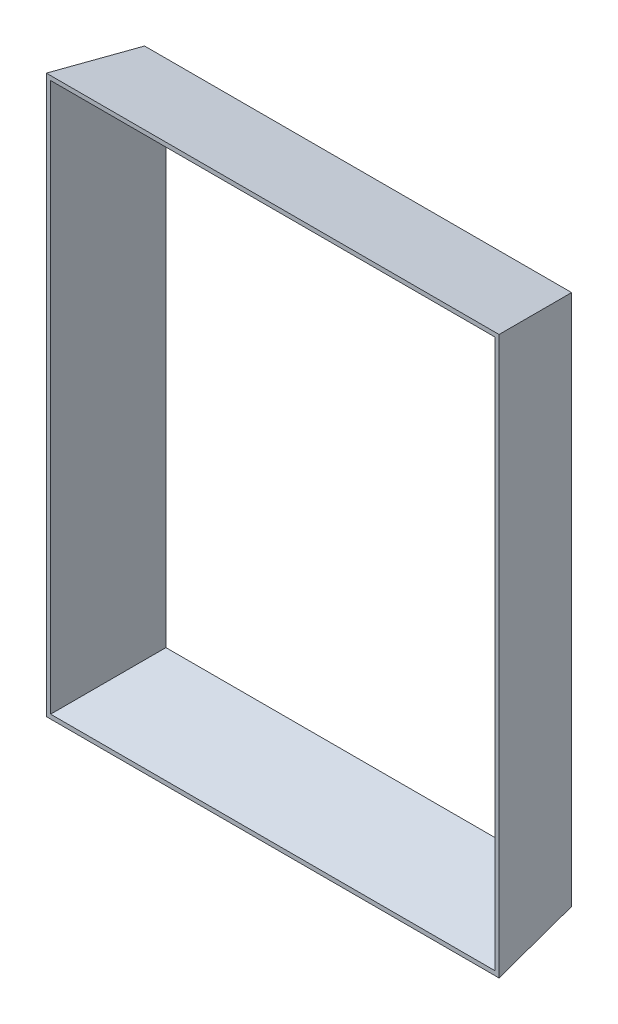
ISO-10303-21;
HEADER;
FILE_DESCRIPTION(('STEP AP214'),'2;1');
FILE_NAME('part.step','',(''),(''),'','','');
FILE_SCHEMA(('AUTOMOTIVE_DESIGN { 1 0 10303 214 1 1 1 1 }'));
ENDSEC;
DATA;
#1=APPLICATION_CONTEXT('core data for automotive mechanical design processes');
#2=APPLICATION_PROTOCOL_DEFINITION('international standard','automotive_design',2000,#1);
#3=PRODUCT_CONTEXT('',#1,'mechanical');
#4=PRODUCT('Part','Part','',(#3));
#5=PRODUCT_RELATED_PRODUCT_CATEGORY('part','',(#4));
#6=PRODUCT_DEFINITION_FORMATION('','',#4);
#7=PRODUCT_DEFINITION_CONTEXT('part definition',#1,'design');
#8=PRODUCT_DEFINITION('design','',#6,#7);
#9=PRODUCT_DEFINITION_SHAPE('','',#8);
#10=(LENGTH_UNIT() NAMED_UNIT(*) SI_UNIT(.MILLI.,.METRE.));
#11=(NAMED_UNIT(*) PLANE_ANGLE_UNIT() SI_UNIT($,.RADIAN.));
#12=(NAMED_UNIT(*) SI_UNIT($,.STERADIAN.) SOLID_ANGLE_UNIT());
#13=UNCERTAINTY_MEASURE_WITH_UNIT(LENGTH_MEASURE(1.E-05),#10,'distance_accuracy_value','');
#14=(GEOMETRIC_REPRESENTATION_CONTEXT(3) GLOBAL_UNCERTAINTY_ASSIGNED_CONTEXT((#13)) GLOBAL_UNIT_ASSIGNED_CONTEXT((#10,
#11,#12)) REPRESENTATION_CONTEXT('',''));
#15=CARTESIAN_POINT('',(0.,0.,0.));
#16=DIRECTION('',(0.,0.,1.));
#17=DIRECTION('',(1.,0.,0.));
#18=AXIS2_PLACEMENT_3D('',#15,#16,#17);
#19=CARTESIAN_POINT('',(0.,0.,0.));
#20=DIRECTION('',(0.,0.,1.));
#21=DIRECTION('',(1.,0.,0.));
#22=AXIS2_PLACEMENT_3D('',#19,#20,#21);
#23=PLANE('',#22);
#24=DIRECTION('',(0.,-1.,0.));
#25=VECTOR('',#24,1.);
#26=CARTESIAN_POINT('',(-1254.02572347267,611.927652733119,0.));
#27=LINE('',#26,#25);
#28=CARTESIAN_POINT('',(-1254.02572347267,611.927652733119,0.));
#29=VERTEX_POINT('',#28);
#30=CARTESIAN_POINT('',(-1254.02572347267,-633.072347266881,0.));
#31=VERTEX_POINT('',#30);
#32=EDGE_CURVE('E177',#29,#31,#27,.T.);
#33=ORIENTED_EDGE('',*,*,#32,.F.);
#34=DIRECTION('',(-1.,0.,0.));
#35=VECTOR('',#34,1.);
#36=CARTESIAN_POINT('',(-1254.02572347267,611.927652733119,0.));
#37=LINE('',#36,#35);
#38=CARTESIAN_POINT('',(-254.025723472669,611.927652733119,0.));
#39=VERTEX_POINT('',#38);
#40=EDGE_CURVE('E12',#39,#29,#37,.T.);
#41=ORIENTED_EDGE('',*,*,#40,.F.);
#42=DIRECTION('',(0.,1.,0.));
#43=VECTOR('',#42,1.);
#44=CARTESIAN_POINT('',(-254.025723472669,611.927652733119,0.));
#45=LINE('',#44,#43);
#46=CARTESIAN_POINT('',(-254.025723472668,-633.072347266881,0.));
#47=VERTEX_POINT('',#46);
#48=EDGE_CURVE('E62',#47,#39,#45,.T.);
#49=ORIENTED_EDGE('',*,*,#48,.F.);
#50=DIRECTION('',(1.,0.,0.));
#51=VECTOR('',#50,1.);
#52=CARTESIAN_POINT('',(-1254.02572347267,-633.072347266881,0.));
#53=LINE('',#52,#51);
#54=EDGE_CURVE('E178',#31,#47,#53,.T.);
#55=ORIENTED_EDGE('',*,*,#54,.F.);
#56=EDGE_LOOP('',(#33,#41,#49,#55));
#57=FACE_BOUND('',#56,.T.);
#58=DIRECTION('',(0.,-1.,0.));
#59=VECTOR('',#58,1.);
#60=CARTESIAN_POINT('',(-1204.02572347267,561.927652733119,0.));
#61=LINE('',#60,#59);
#62=CARTESIAN_POINT('',(-1204.02572347267,561.927652733119,0.));
#63=VERTEX_POINT('',#62);
#64=CARTESIAN_POINT('',(-1204.02572347267,-583.072347266881,0.));
#65=VERTEX_POINT('',#64);
#66=EDGE_CURVE('E129',#63,#65,#61,.T.);
#67=ORIENTED_EDGE('',*,*,#66,.T.);
#68=DIRECTION('',(1.,0.,0.));
#69=VECTOR('',#68,1.);
#70=CARTESIAN_POINT('',(-1204.02572347267,-583.072347266881,0.));
#71=LINE('',#70,#69);
#72=CARTESIAN_POINT('',(-304.025723472668,-583.072347266881,0.));
#73=VERTEX_POINT('',#72);
#74=EDGE_CURVE('E119',#65,#73,#71,.T.);
#75=ORIENTED_EDGE('',*,*,#74,.T.);
#76=DIRECTION('',(0.,1.,0.));
#77=VECTOR('',#76,1.);
#78=CARTESIAN_POINT('',(-304.025723472668,-583.072347266881,0.));
#79=LINE('',#78,#77);
#80=CARTESIAN_POINT('',(-304.025723472669,561.927652733119,0.));
#81=VERTEX_POINT('',#80);
#82=EDGE_CURVE('E128',#73,#81,#79,.T.);
#83=ORIENTED_EDGE('',*,*,#82,.T.);
#84=DIRECTION('',(-1.,0.,0.));
#85=VECTOR('',#84,1.);
#86=CARTESIAN_POINT('',(-304.025723472669,561.927652733119,0.));
#87=LINE('',#86,#85);
#88=EDGE_CURVE('E138',#81,#63,#87,.T.);
#89=ORIENTED_EDGE('',*,*,#88,.T.);
#90=EDGE_LOOP('',(#67,#75,#83,#89));
#91=FACE_BOUND('',#90,.T.);
#92=ADVANCED_FACE('F53',(#57,#91),#23,.F.);
#93=CARTESIAN_POINT('',(0.,0.,200.));
#94=DIRECTION('',(0.,0.,1.));
#95=DIRECTION('',(1.,0.,0.));
#96=AXIS2_PLACEMENT_3D('',#93,#94,#95);
#97=PLANE('',#96);
#98=DIRECTION('',(1.,0.,0.));
#99=VECTOR('',#98,1.);
#100=CARTESIAN_POINT('',(-1284.02572347267,-663.072347266881,200.));
#101=LINE('',#100,#99);
#102=CARTESIAN_POINT('',(-1284.02572347267,-663.072347266881,200.));
#103=VERTEX_POINT('',#102);
#104=CARTESIAN_POINT('',(-224.025723472668,-663.072347266881,200.));
#105=VERTEX_POINT('',#104);
#106=EDGE_CURVE('E164',#103,#105,#101,.T.);
#107=ORIENTED_EDGE('',*,*,#106,.T.);
#108=DIRECTION('',(0.,1.,0.));
#109=VECTOR('',#108,1.);
#110=CARTESIAN_POINT('',(-224.025723472668,-663.072347266881,200.));
#111=LINE('',#110,#109);
#112=CARTESIAN_POINT('',(-224.025723472669,641.927652733119,200.));
#113=VERTEX_POINT('',#112);
#114=EDGE_CURVE('E240',#105,#113,#111,.T.);
#115=ORIENTED_EDGE('',*,*,#114,.T.);
#116=DIRECTION('',(-1.,0.,0.));
#117=VECTOR('',#116,1.);
#118=CARTESIAN_POINT('',(-224.025723472669,641.927652733119,200.));
#119=LINE('',#118,#117);
#120=CARTESIAN_POINT('',(-1284.02572347267,641.927652733119,200.));
#121=VERTEX_POINT('',#120);
#122=EDGE_CURVE('E224',#113,#121,#119,.T.);
#123=ORIENTED_EDGE('',*,*,#122,.T.);
#124=DIRECTION('',(0.,-1.,0.));
#125=VECTOR('',#124,1.);
#126=CARTESIAN_POINT('',(-1284.02572347267,641.927652733119,200.));
#127=LINE('',#126,#125);
#128=EDGE_CURVE('E304',#121,#103,#127,.T.);
#129=ORIENTED_EDGE('',*,*,#128,.T.);
#130=EDGE_LOOP('',(#107,#115,#123,#129));
#131=FACE_BOUND('',#130,.T.);
#132=DIRECTION('',(1.,0.,0.));
#133=VECTOR('',#132,1.);
#134=CARTESIAN_POINT('',(-1274.02572347267,-653.072347266881,200.));
#135=LINE('',#134,#133);
#136=CARTESIAN_POINT('',(-1274.02572347267,-653.072347266881,200.));
#137=VERTEX_POINT('',#136);
#138=CARTESIAN_POINT('',(-234.025723472668,-653.072347266881,200.));
#139=VERTEX_POINT('',#138);
#140=EDGE_CURVE('E78',#137,#139,#135,.T.);
#141=ORIENTED_EDGE('',*,*,#140,.F.);
#142=DIRECTION('',(0.,-1.,0.));
#143=VECTOR('',#142,1.);
#144=CARTESIAN_POINT('',(-1274.02572347267,631.927652733119,200.));
#145=LINE('',#144,#143);
#146=CARTESIAN_POINT('',(-1274.02572347267,631.927652733119,200.));
#147=VERTEX_POINT('',#146);
#148=EDGE_CURVE('E136',#147,#137,#145,.T.);
#149=ORIENTED_EDGE('',*,*,#148,.F.);
#150=DIRECTION('',(-1.,0.,0.));
#151=VECTOR('',#150,1.);
#152=CARTESIAN_POINT('',(-234.025723472669,631.927652733119,200.));
#153=LINE('',#152,#151);
#154=CARTESIAN_POINT('',(-234.025723472669,631.927652733119,200.));
#155=VERTEX_POINT('',#154);
#156=EDGE_CURVE('E152',#155,#147,#153,.T.);
#157=ORIENTED_EDGE('',*,*,#156,.F.);
#158=DIRECTION('',(0.,1.,0.));
#159=VECTOR('',#158,1.);
#160=CARTESIAN_POINT('',(-234.025723472668,-653.072347266881,200.));
#161=LINE('',#160,#159);
#162=EDGE_CURVE('E160',#139,#155,#161,.T.);
#163=ORIENTED_EDGE('',*,*,#162,.F.);
#164=EDGE_LOOP('',(#141,#149,#157,#163));
#165=FACE_BOUND('',#164,.T.);
#166=ADVANCED_FACE('F336',(#131,#165),#97,.T.);
#167=CARTESIAN_POINT('',(-1226.43102540114,-2.18732845383934E-13,-183.964653810172));
#168=DIRECTION('',(-0.988936352868298,0.,-0.148340452930245));
#169=DIRECTION('',(-0.148340452930245,0.,0.988936352868298));
#170=AXIS2_PLACEMENT_3D('',#167,#168,#169);
#171=PLANE('',#170);
#172=DIRECTION('',(0.146734796413356,-0.146734796413356,-0.978231976089037));
#173=VECTOR('',#172,1.);
#174=CARTESIAN_POINT('',(-1284.02572347267,641.927652733119,200.));
#175=LINE('',#174,#173);
#176=EDGE_CURVE('E230',#121,#29,#175,.T.);
#177=ORIENTED_EDGE('',*,*,#176,.T.);
#178=ORIENTED_EDGE('',*,*,#32,.T.);
#179=DIRECTION('',(0.146734796413356,0.146734796413356,-0.978231976089037));
#180=VECTOR('',#179,1.);
#181=CARTESIAN_POINT('',(-1284.02572347267,-663.072347266881,200.));
#182=LINE('',#181,#180);
#183=EDGE_CURVE('E226',#103,#31,#182,.T.);
#184=ORIENTED_EDGE('',*,*,#183,.F.);
#185=ORIENTED_EDGE('',*,*,#128,.F.);
#186=EDGE_LOOP('',(#177,#178,#184,#185));
#187=FACE_BOUND('',#186,.T.);
#188=ADVANCED_FACE('F277',(#187),#171,.T.);
#189=CARTESIAN_POINT('',(0.,-619.14165991871,-92.8712489878066));
#190=DIRECTION('',(0.,-0.988936352868298,-0.148340452930245));
#191=DIRECTION('',(0.,0.148340452930245,-0.988936352868298));
#192=AXIS2_PLACEMENT_3D('',#189,#190,#191);
#193=PLANE('',#192);
#194=ORIENTED_EDGE('',*,*,#183,.T.);
#195=ORIENTED_EDGE('',*,*,#54,.T.);
#196=DIRECTION('',(-0.146734796413356,0.146734796413356,-0.978231976089037));
#197=VECTOR('',#196,1.);
#198=CARTESIAN_POINT('',(-224.025723472668,-663.072347266881,200.));
#199=LINE('',#198,#197);
#200=EDGE_CURVE('E207',#105,#47,#199,.T.);
#201=ORIENTED_EDGE('',*,*,#200,.F.);
#202=ORIENTED_EDGE('',*,*,#106,.F.);
#203=EDGE_LOOP('',(#194,#195,#201,#202));
#204=FACE_BOUND('',#203,.T.);
#205=ADVANCED_FACE('F268',(#204),#193,.T.);
#206=CARTESIAN_POINT('',(0.,598.46225206173,-89.7693378092596));
#207=DIRECTION('',(0.,0.988936352868298,-0.148340452930245));
#208=DIRECTION('',(0.,0.148340452930245,0.988936352868298));
#209=AXIS2_PLACEMENT_3D('',#206,#207,#208);
#210=PLANE('',#209);
#211=DIRECTION('',(-0.146734796413356,-0.146734796413356,-0.978231976089037));
#212=VECTOR('',#211,1.);
#213=CARTESIAN_POINT('',(-224.025723472669,641.927652733119,200.));
#214=LINE('',#213,#212);
#215=EDGE_CURVE('E217',#113,#39,#214,.T.);
#216=ORIENTED_EDGE('',*,*,#215,.T.);
#217=ORIENTED_EDGE('',*,*,#40,.T.);
#218=ORIENTED_EDGE('',*,*,#176,.F.);
#219=ORIENTED_EDGE('',*,*,#122,.F.);
#220=EDGE_LOOP('',(#216,#217,#218,#219));
#221=FACE_BOUND('',#220,.T.);
#222=ADVANCED_FACE('F222',(#221),#210,.T.);
#223=CARTESIAN_POINT('',(-248.435915376693,0.,37.2653873065039));
#224=DIRECTION('',(0.988936352868298,0.,-0.148340452930245));
#225=DIRECTION('',(-0.148340452930245,0.,-0.988936352868298));
#226=AXIS2_PLACEMENT_3D('',#223,#224,#225);
#227=PLANE('',#226);
#228=ORIENTED_EDGE('',*,*,#200,.T.);
#229=ORIENTED_EDGE('',*,*,#48,.T.);
#230=ORIENTED_EDGE('',*,*,#215,.F.);
#231=ORIENTED_EDGE('',*,*,#114,.F.);
#232=EDGE_LOOP('',(#228,#229,#230,#231));
#233=FACE_BOUND('',#232,.T.);
#234=ADVANCED_FACE('F216',(#233),#227,.T.);
#235=CARTESIAN_POINT('',(-1072.62870687988,-1.8534740657618E-13,-375.420047407959));
#236=DIRECTION('',(0.943858356366017,0.,0.330350424728106));
#237=DIRECTION('',(0.330350424728106,0.,-0.943858356366017));
#238=AXIS2_PLACEMENT_3D('',#235,#236,#237);
#239=PLANE('',#238);
#240=DIRECTION('',(-0.313677500463755,-0.313677500463755,0.896221429896441));
#241=VECTOR('',#240,1.);
#242=CARTESIAN_POINT('',(-1204.02572347267,-583.072347266881,0.));
#243=LINE('',#242,#241);
#244=EDGE_CURVE('E122',#65,#137,#243,.T.);
#245=ORIENTED_EDGE('',*,*,#244,.F.);
#246=ORIENTED_EDGE('',*,*,#66,.F.);
#247=DIRECTION('',(-0.313677500463755,0.313677500463755,0.896221429896441));
#248=VECTOR('',#247,1.);
#249=CARTESIAN_POINT('',(-1204.02572347267,561.927652733119,0.));
#250=LINE('',#249,#248);
#251=EDGE_CURVE('E137',#63,#147,#250,.T.);
#252=ORIENTED_EDGE('',*,*,#251,.T.);
#253=ORIENTED_EDGE('',*,*,#148,.T.);
#254=EDGE_LOOP('',(#245,#246,#252,#253));
#255=FACE_BOUND('',#254,.T.);
#256=ADVANCED_FACE('F133',(#255),#239,.T.);
#257=CARTESIAN_POINT('',(0.,500.603699539527,-175.211294838835));
#258=DIRECTION('',(0.,-0.943858356366017,0.330350424728106));
#259=DIRECTION('',(0.,-0.330350424728106,-0.943858356366017));
#260=AXIS2_PLACEMENT_3D('',#257,#258,#259);
#261=PLANE('',#260);
#262=ORIENTED_EDGE('',*,*,#251,.F.);
#263=ORIENTED_EDGE('',*,*,#88,.F.);
#264=DIRECTION('',(0.313677500463754,0.313677500463755,0.896221429896442));
#265=VECTOR('',#264,1.);
#266=CARTESIAN_POINT('',(-304.025723472669,561.927652733119,0.));
#267=LINE('',#266,#265);
#268=EDGE_CURVE('E70',#81,#155,#267,.T.);
#269=ORIENTED_EDGE('',*,*,#268,.T.);
#270=ORIENTED_EDGE('',*,*,#156,.T.);
#271=EDGE_LOOP('',(#262,#263,#269,#270));
#272=FACE_BOUND('',#271,.T.);
#273=ADVANCED_FACE('F333',(#272),#261,.T.);
#274=CARTESIAN_POINT('',(0.,-519.440843890317,-181.804295361611));
#275=DIRECTION('',(0.,0.943858356366017,0.330350424728106));
#276=DIRECTION('',(0.,-0.330350424728106,0.943858356366017));
#277=AXIS2_PLACEMENT_3D('',#274,#275,#276);
#278=PLANE('',#277);
#279=DIRECTION('',(0.313677500463754,-0.313677500463755,0.896221429896442));
#280=VECTOR('',#279,1.);
#281=CARTESIAN_POINT('',(-304.025723472668,-583.072347266881,0.));
#282=LINE('',#281,#280);
#283=EDGE_CURVE('E124',#73,#139,#282,.T.);
#284=ORIENTED_EDGE('',*,*,#283,.F.);
#285=ORIENTED_EDGE('',*,*,#74,.F.);
#286=ORIENTED_EDGE('',*,*,#244,.T.);
#287=ORIENTED_EDGE('',*,*,#140,.T.);
#288=EDGE_LOOP('',(#284,#285,#286,#287));
#289=FACE_BOUND('',#288,.T.);
#290=ADVANCED_FACE('F121',(#289),#278,.T.);
#291=CARTESIAN_POINT('',(-270.846969686119,0.,94.7964393901416));
#292=DIRECTION('',(-0.943858356366018,0.,0.330350424728106));
#293=DIRECTION('',(0.330350424728106,0.,0.943858356366018));
#294=AXIS2_PLACEMENT_3D('',#291,#292,#293);
#295=PLANE('',#294);
#296=ORIENTED_EDGE('',*,*,#268,.F.);
#297=ORIENTED_EDGE('',*,*,#82,.F.);
#298=ORIENTED_EDGE('',*,*,#283,.T.);
#299=ORIENTED_EDGE('',*,*,#162,.T.);
#300=EDGE_LOOP('',(#296,#297,#298,#299));
#301=FACE_BOUND('',#300,.T.);
#302=ADVANCED_FACE('F337',(#301),#295,.T.);
#303=CLOSED_SHELL('',(#92,#166,#188,#205,#222,#234,#256,#273,#290,#302));
#304=MANIFOLD_SOLID_BREP('B2',#303);
#305=ADVANCED_BREP_SHAPE_REPRESENTATION('',(#18,#304),#14);
#306=SHAPE_DEFINITION_REPRESENTATION(#9,#305);
ENDSEC;
END-ISO-10303-21;
